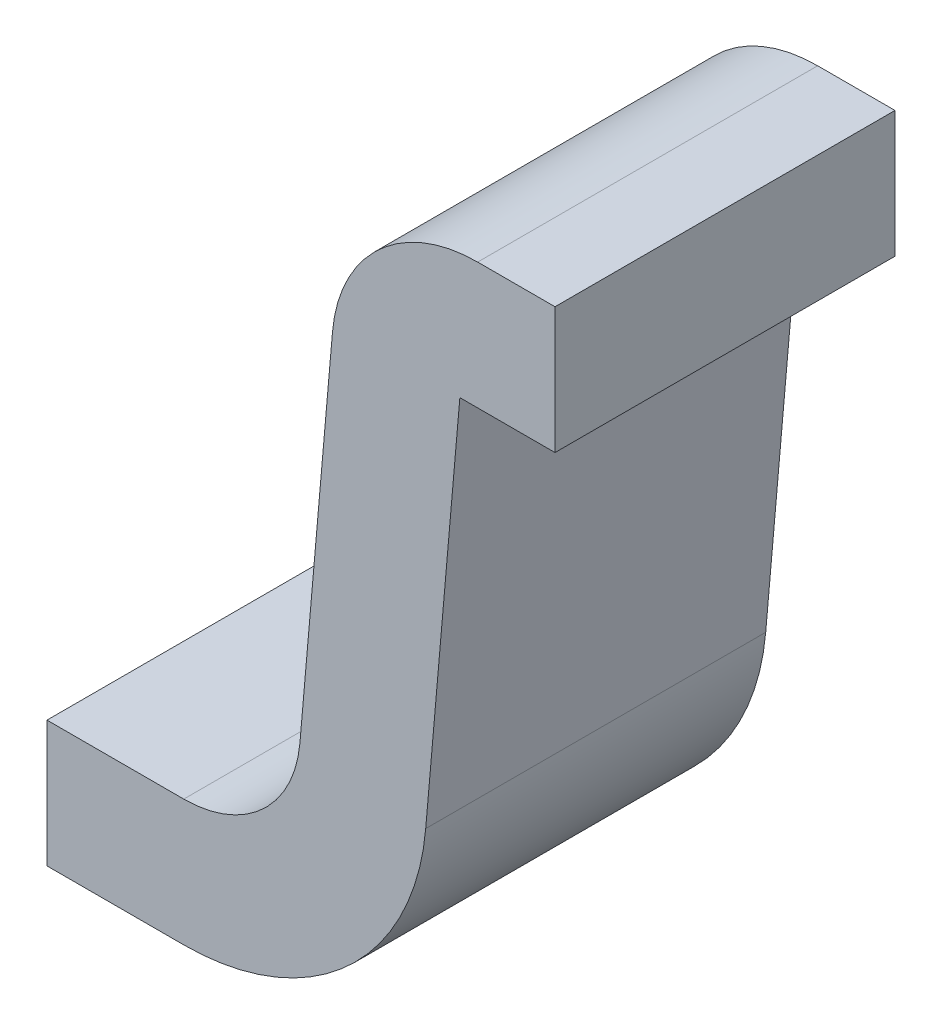
ISO-10303-21;
HEADER;
FILE_DESCRIPTION(('STEP AP214'),'2;1');
FILE_NAME('part.step','',(''),(''),'','','');
FILE_SCHEMA(('AUTOMOTIVE_DESIGN { 1 0 10303 214 1 1 1 1 }'));
ENDSEC;
DATA;
#1=APPLICATION_CONTEXT('core data for automotive mechanical design processes');
#2=APPLICATION_PROTOCOL_DEFINITION('international standard','automotive_design',2000,#1);
#3=PRODUCT_CONTEXT('',#1,'mechanical');
#4=PRODUCT('Part','Part','',(#3));
#5=PRODUCT_RELATED_PRODUCT_CATEGORY('part','',(#4));
#6=PRODUCT_DEFINITION_FORMATION('','',#4);
#7=PRODUCT_DEFINITION_CONTEXT('part definition',#1,'design');
#8=PRODUCT_DEFINITION('design','',#6,#7);
#9=PRODUCT_DEFINITION_SHAPE('','',#8);
#10=(LENGTH_UNIT() NAMED_UNIT(*) SI_UNIT(.MILLI.,.METRE.));
#11=(NAMED_UNIT(*) PLANE_ANGLE_UNIT() SI_UNIT($,.RADIAN.));
#12=(NAMED_UNIT(*) SI_UNIT($,.STERADIAN.) SOLID_ANGLE_UNIT());
#13=UNCERTAINTY_MEASURE_WITH_UNIT(LENGTH_MEASURE(1.E-05),#10,'distance_accuracy_value','');
#14=(GEOMETRIC_REPRESENTATION_CONTEXT(3) GLOBAL_UNCERTAINTY_ASSIGNED_CONTEXT((#13)) GLOBAL_UNIT_ASSIGNED_CONTEXT((#10,
#11,#12)) REPRESENTATION_CONTEXT('',''));
#15=CARTESIAN_POINT('',(0.,0.,0.));
#16=DIRECTION('',(0.,0.,1.));
#17=DIRECTION('',(1.,0.,0.));
#18=AXIS2_PLACEMENT_3D('',#15,#16,#17);
#19=CARTESIAN_POINT('',(-0.284200651525688,-0.38,0.));
#20=DIRECTION('',(0.,0.,-1.));
#21=DIRECTION('',(0.,-1.,0.));
#22=AXIS2_PLACEMENT_3D('',#19,#20,#21);
#23=PLANE('',#22);
#24=DIRECTION('',(0.0871557427476581,0.996194698091746,0.));
#25=VECTOR('',#24,1.);
#26=CARTESIAN_POINT('',(0.,0.,0.));
#27=LINE('',#26,#25);
#28=CARTESIAN_POINT('',(-0.0351519770027516,-0.401788935686914,0.));
#29=VERTEX_POINT('',#28);
#30=CARTESIAN_POINT('',(0.,0.,0.));
#31=VERTEX_POINT('',#30);
#32=EDGE_CURVE('E240',#29,#31,#27,.T.);
#33=ORIENTED_EDGE('',*,*,#32,.F.);
#34=CARTESIAN_POINT('',(-0.284200651525688,-0.38,0.));
#35=DIRECTION('',(0.,0.,1.));
#36=DIRECTION('',(-1.,0.,0.));
#37=AXIS2_PLACEMENT_3D('',#34,#35,#36);
#38=CIRCLE('',#37,0.25);
#39=CARTESIAN_POINT('',(-0.284200651525688,-0.63,0.));
#40=VERTEX_POINT('',#39);
#41=EDGE_CURVE('E25',#40,#29,#38,.T.);
#42=ORIENTED_EDGE('',*,*,#41,.F.);
#43=DIRECTION('',(1.,0.,0.));
#44=VECTOR('',#43,1.);
#45=CARTESIAN_POINT('',(-0.284200651525688,-0.63,0.));
#46=LINE('',#45,#44);
#47=CARTESIAN_POINT('',(-0.425,-0.63,0.));
#48=VERTEX_POINT('',#47);
#49=EDGE_CURVE('E214',#48,#40,#46,.T.);
#50=ORIENTED_EDGE('',*,*,#49,.F.);
#51=DIRECTION('',(0.,-1.,0.));
#52=VECTOR('',#51,1.);
#53=CARTESIAN_POINT('',(-0.425,-0.63,0.));
#54=LINE('',#53,#52);
#55=CARTESIAN_POINT('',(-0.425,-0.5,0.));
#56=VERTEX_POINT('',#55);
#57=EDGE_CURVE('E161',#56,#48,#54,.T.);
#58=ORIENTED_EDGE('',*,*,#57,.F.);
#59=DIRECTION('',(-1.,0.,0.));
#60=VECTOR('',#59,1.);
#61=CARTESIAN_POINT('',(-0.425,-0.5,0.));
#62=LINE('',#61,#60);
#63=CARTESIAN_POINT('',(-0.284200651525688,-0.5,0.));
#64=VERTEX_POINT('',#63);
#65=EDGE_CURVE('E197',#64,#56,#62,.T.);
#66=ORIENTED_EDGE('',*,*,#65,.F.);
#67=CARTESIAN_POINT('',(-0.284200651525688,-0.38,0.));
#68=DIRECTION('',(0.,0.,-1.));
#69=DIRECTION('',(1.,0.,0.));
#70=AXIS2_PLACEMENT_3D('',#67,#68,#69);
#71=CIRCLE('',#70,0.12);
#72=CARTESIAN_POINT('',(-0.164657287754679,-0.390458689129719,0.));
#73=VERTEX_POINT('',#72);
#74=EDGE_CURVE('E187',#73,#64,#71,.T.);
#75=ORIENTED_EDGE('',*,*,#74,.F.);
#76=DIRECTION('',(-0.0871557427476581,-0.996194698091746,0.));
#77=VECTOR('',#76,1.);
#78=CARTESIAN_POINT('',(-0.164657287754679,-0.390458689129719,0.));
#79=LINE('',#78,#77);
#80=CARTESIAN_POINT('',(-0.131102581233413,-0.00692663858785125,0.));
#81=VERTEX_POINT('',#80);
#82=EDGE_CURVE('E176',#81,#73,#79,.T.);
#83=ORIENTED_EDGE('',*,*,#82,.F.);
#84=CARTESIAN_POINT('',(0.0183266234803484,-0.02,0.));
#85=DIRECTION('',(0.,0.,1.));
#86=DIRECTION('',(1.,0.,0.));
#87=AXIS2_PLACEMENT_3D('',#84,#85,#86);
#88=CIRCLE('',#87,0.15);
#89=CARTESIAN_POINT('',(0.0183266234803484,0.13,0.));
#90=VERTEX_POINT('',#89);
#91=EDGE_CURVE('E127',#90,#81,#88,.T.);
#92=ORIENTED_EDGE('',*,*,#91,.F.);
#93=DIRECTION('',(-1.,0.,0.));
#94=VECTOR('',#93,1.);
#95=CARTESIAN_POINT('',(0.0979446320840572,0.13,0.));
#96=LINE('',#95,#94);
#97=CARTESIAN_POINT('',(0.0979446320840572,0.13,0.));
#98=VERTEX_POINT('',#97);
#99=EDGE_CURVE('E123',#98,#90,#96,.T.);
#100=ORIENTED_EDGE('',*,*,#99,.F.);
#101=DIRECTION('',(0.,1.,0.));
#102=VECTOR('',#101,1.);
#103=CARTESIAN_POINT('',(0.0979446320840572,0.,0.));
#104=LINE('',#103,#102);
#105=CARTESIAN_POINT('',(0.0979446320840572,0.,0.));
#106=VERTEX_POINT('',#105);
#107=EDGE_CURVE('E130',#106,#98,#104,.T.);
#108=ORIENTED_EDGE('',*,*,#107,.F.);
#109=DIRECTION('',(1.,0.,0.));
#110=VECTOR('',#109,1.);
#111=CARTESIAN_POINT('',(0.,0.,0.));
#112=LINE('',#111,#110);
#113=EDGE_CURVE('E239',#31,#106,#112,.T.);
#114=ORIENTED_EDGE('',*,*,#113,.F.);
#115=EDGE_LOOP('',(#33,#42,#50,#58,#66,#75,#83,#92,#100,#108,#114));
#116=FACE_BOUND('',#115,.T.);
#117=ADVANCED_FACE('F16',(#116),#23,.T.);
#118=CARTESIAN_POINT('',(-0.284200651525688,-0.38,0.35));
#119=DIRECTION('',(0.,0.,-1.));
#120=DIRECTION('',(0.,-1.,0.));
#121=AXIS2_PLACEMENT_3D('',#118,#119,#120);
#122=PLANE('',#121);
#123=DIRECTION('',(0.0871557427476581,0.996194698091746,0.));
#124=VECTOR('',#123,1.);
#125=CARTESIAN_POINT('',(0.,0.,0.35));
#126=LINE('',#125,#124);
#127=CARTESIAN_POINT('',(-0.0351519770027516,-0.401788935686914,0.35));
#128=VERTEX_POINT('',#127);
#129=CARTESIAN_POINT('',(0.,0.,0.35));
#130=VERTEX_POINT('',#129);
#131=EDGE_CURVE('E238',#128,#130,#126,.T.);
#132=ORIENTED_EDGE('',*,*,#131,.T.);
#133=DIRECTION('',(1.,0.,0.));
#134=VECTOR('',#133,1.);
#135=CARTESIAN_POINT('',(0.,0.,0.35));
#136=LINE('',#135,#134);
#137=CARTESIAN_POINT('',(0.0979446320840572,0.,0.35));
#138=VERTEX_POINT('',#137);
#139=EDGE_CURVE('E151',#130,#138,#136,.T.);
#140=ORIENTED_EDGE('',*,*,#139,.T.);
#141=DIRECTION('',(0.,1.,0.));
#142=VECTOR('',#141,1.);
#143=CARTESIAN_POINT('',(0.0979446320840572,0.,0.35));
#144=LINE('',#143,#142);
#145=CARTESIAN_POINT('',(0.0979446320840572,0.13,0.35));
#146=VERTEX_POINT('',#145);
#147=EDGE_CURVE('E134',#138,#146,#144,.T.);
#148=ORIENTED_EDGE('',*,*,#147,.T.);
#149=DIRECTION('',(-1.,0.,0.));
#150=VECTOR('',#149,1.);
#151=CARTESIAN_POINT('',(0.0979446320840572,0.13,0.35));
#152=LINE('',#151,#150);
#153=CARTESIAN_POINT('',(0.0183266234803484,0.13,0.35));
#154=VERTEX_POINT('',#153);
#155=EDGE_CURVE('E143',#146,#154,#152,.T.);
#156=ORIENTED_EDGE('',*,*,#155,.T.);
#157=CARTESIAN_POINT('',(0.0183266234803484,-0.02,0.35));
#158=DIRECTION('',(0.,0.,1.));
#159=DIRECTION('',(1.,0.,0.));
#160=AXIS2_PLACEMENT_3D('',#157,#158,#159);
#161=CIRCLE('',#160,0.15);
#162=CARTESIAN_POINT('',(-0.131102581233413,-0.00692663858785125,0.35));
#163=VERTEX_POINT('',#162);
#164=EDGE_CURVE('E175',#154,#163,#161,.T.);
#165=ORIENTED_EDGE('',*,*,#164,.T.);
#166=DIRECTION('',(-0.0871557427476581,-0.996194698091746,0.));
#167=VECTOR('',#166,1.);
#168=CARTESIAN_POINT('',(-0.164657287754679,-0.390458689129719,0.35));
#169=LINE('',#168,#167);
#170=CARTESIAN_POINT('',(-0.164657287754679,-0.390458689129719,0.35));
#171=VERTEX_POINT('',#170);
#172=EDGE_CURVE('E182',#163,#171,#169,.T.);
#173=ORIENTED_EDGE('',*,*,#172,.T.);
#174=CARTESIAN_POINT('',(-0.284200651525688,-0.38,0.35));
#175=DIRECTION('',(0.,0.,-1.));
#176=DIRECTION('',(1.,0.,0.));
#177=AXIS2_PLACEMENT_3D('',#174,#175,#176);
#178=CIRCLE('',#177,0.12);
#179=CARTESIAN_POINT('',(-0.284200651525688,-0.5,0.35));
#180=VERTEX_POINT('',#179);
#181=EDGE_CURVE('E198',#171,#180,#178,.T.);
#182=ORIENTED_EDGE('',*,*,#181,.T.);
#183=DIRECTION('',(-1.,0.,0.));
#184=VECTOR('',#183,1.);
#185=CARTESIAN_POINT('',(-0.425,-0.5,0.35));
#186=LINE('',#185,#184);
#187=CARTESIAN_POINT('',(-0.425,-0.5,0.35));
#188=VERTEX_POINT('',#187);
#189=EDGE_CURVE('E164',#180,#188,#186,.T.);
#190=ORIENTED_EDGE('',*,*,#189,.T.);
#191=DIRECTION('',(0.,-1.,0.));
#192=VECTOR('',#191,1.);
#193=CARTESIAN_POINT('',(-0.425,-0.63,0.35));
#194=LINE('',#193,#192);
#195=CARTESIAN_POINT('',(-0.425,-0.63,0.35));
#196=VERTEX_POINT('',#195);
#197=EDGE_CURVE('E211',#188,#196,#194,.T.);
#198=ORIENTED_EDGE('',*,*,#197,.T.);
#199=DIRECTION('',(1.,0.,0.));
#200=VECTOR('',#199,1.);
#201=CARTESIAN_POINT('',(-0.284200651525688,-0.63,0.35));
#202=LINE('',#201,#200);
#203=CARTESIAN_POINT('',(-0.284200651525688,-0.63,0.35));
#204=VERTEX_POINT('',#203);
#205=EDGE_CURVE('E225',#196,#204,#202,.T.);
#206=ORIENTED_EDGE('',*,*,#205,.T.);
#207=CARTESIAN_POINT('',(-0.284200651525688,-0.38,0.35));
#208=DIRECTION('',(0.,0.,1.));
#209=DIRECTION('',(-1.,0.,0.));
#210=AXIS2_PLACEMENT_3D('',#207,#208,#209);
#211=CIRCLE('',#210,0.25);
#212=EDGE_CURVE('E11',#204,#128,#211,.T.);
#213=ORIENTED_EDGE('',*,*,#212,.T.);
#214=EDGE_LOOP('',(#132,#140,#148,#156,#165,#173,#182,#190,#198,#206,#213));
#215=FACE_BOUND('',#214,.T.);
#216=ADVANCED_FACE('F18',(#215),#122,.F.);
#217=CARTESIAN_POINT('',(-0.284200651525688,-0.38,0.35));
#218=DIRECTION('',(0.,0.,-1.));
#219=DIRECTION('',(-1.,0.,0.));
#220=AXIS2_PLACEMENT_3D('',#217,#218,#219);
#221=CYLINDRICAL_SURFACE('',#220,0.25);
#222=ORIENTED_EDGE('',*,*,#41,.T.);
#223=DIRECTION('',(0.,0.,-1.));
#224=VECTOR('',#223,1.);
#225=CARTESIAN_POINT('',(-0.0351519770027516,-0.401788935686914,0.35));
#226=LINE('',#225,#224);
#227=EDGE_CURVE('E228',#128,#29,#226,.T.);
#228=ORIENTED_EDGE('',*,*,#227,.F.);
#229=ORIENTED_EDGE('',*,*,#212,.F.);
#230=DIRECTION('',(0.,0.,-1.));
#231=VECTOR('',#230,1.);
#232=CARTESIAN_POINT('',(-0.284200651525688,-0.63,0.35));
#233=LINE('',#232,#231);
#234=EDGE_CURVE('E218',#204,#40,#233,.T.);
#235=ORIENTED_EDGE('',*,*,#234,.T.);
#236=EDGE_LOOP('',(#222,#228,#229,#235));
#237=FACE_BOUND('',#236,.T.);
#238=ADVANCED_FACE('F229',(#237),#221,.T.);
#239=CARTESIAN_POINT('',(-0.284200651525688,-0.63,0.35));
#240=DIRECTION('',(0.,1.,0.));
#241=DIRECTION('',(1.,0.,0.));
#242=AXIS2_PLACEMENT_3D('',#239,#240,#241);
#243=PLANE('',#242);
#244=ORIENTED_EDGE('',*,*,#49,.T.);
#245=ORIENTED_EDGE('',*,*,#234,.F.);
#246=ORIENTED_EDGE('',*,*,#205,.F.);
#247=DIRECTION('',(0.,0.,-1.));
#248=VECTOR('',#247,1.);
#249=CARTESIAN_POINT('',(-0.425,-0.63,0.35));
#250=LINE('',#249,#248);
#251=EDGE_CURVE('E163',#196,#48,#250,.T.);
#252=ORIENTED_EDGE('',*,*,#251,.T.);
#253=EDGE_LOOP('',(#244,#245,#246,#252));
#254=FACE_BOUND('',#253,.T.);
#255=ADVANCED_FACE('F427',(#254),#243,.F.);
#256=CARTESIAN_POINT('',(-0.425,-0.63,0.35));
#257=DIRECTION('',(1.,0.,0.));
#258=DIRECTION('',(0.,-1.,0.));
#259=AXIS2_PLACEMENT_3D('',#256,#257,#258);
#260=PLANE('',#259);
#261=ORIENTED_EDGE('',*,*,#57,.T.);
#262=ORIENTED_EDGE('',*,*,#251,.F.);
#263=ORIENTED_EDGE('',*,*,#197,.F.);
#264=DIRECTION('',(0.,0.,-1.));
#265=VECTOR('',#264,1.);
#266=CARTESIAN_POINT('',(-0.425,-0.5,0.35));
#267=LINE('',#266,#265);
#268=EDGE_CURVE('E203',#188,#56,#267,.T.);
#269=ORIENTED_EDGE('',*,*,#268,.T.);
#270=EDGE_LOOP('',(#261,#262,#263,#269));
#271=FACE_BOUND('',#270,.T.);
#272=ADVANCED_FACE('F414',(#271),#260,.F.);
#273=CARTESIAN_POINT('',(-0.425,-0.5,0.35));
#274=DIRECTION('',(0.,-1.,0.));
#275=DIRECTION('',(0.,0.,-1.));
#276=AXIS2_PLACEMENT_3D('',#273,#274,#275);
#277=PLANE('',#276);
#278=ORIENTED_EDGE('',*,*,#65,.T.);
#279=ORIENTED_EDGE('',*,*,#268,.F.);
#280=ORIENTED_EDGE('',*,*,#189,.F.);
#281=DIRECTION('',(0.,0.,-1.));
#282=VECTOR('',#281,1.);
#283=CARTESIAN_POINT('',(-0.284200651525688,-0.5,0.35));
#284=LINE('',#283,#282);
#285=EDGE_CURVE('E195',#180,#64,#284,.T.);
#286=ORIENTED_EDGE('',*,*,#285,.T.);
#287=EDGE_LOOP('',(#278,#279,#280,#286));
#288=FACE_BOUND('',#287,.T.);
#289=ADVANCED_FACE('F407',(#288),#277,.F.);
#290=CARTESIAN_POINT('',(-0.284200651525688,-0.38,0.35));
#291=DIRECTION('',(0.,0.,-1.));
#292=DIRECTION('',(-1.,0.,0.));
#293=AXIS2_PLACEMENT_3D('',#290,#291,#292);
#294=CYLINDRICAL_SURFACE('',#293,0.12);
#295=ORIENTED_EDGE('',*,*,#74,.T.);
#296=ORIENTED_EDGE('',*,*,#285,.F.);
#297=ORIENTED_EDGE('',*,*,#181,.F.);
#298=DIRECTION('',(0.,0.,-1.));
#299=VECTOR('',#298,1.);
#300=CARTESIAN_POINT('',(-0.164657287754679,-0.390458689129719,0.35));
#301=LINE('',#300,#299);
#302=EDGE_CURVE('E179',#171,#73,#301,.T.);
#303=ORIENTED_EDGE('',*,*,#302,.T.);
#304=EDGE_LOOP('',(#295,#296,#297,#303));
#305=FACE_BOUND('',#304,.T.);
#306=ADVANCED_FACE('F380',(#305),#294,.F.);
#307=CARTESIAN_POINT('',(-0.164657287754679,-0.390458689129719,0.35));
#308=DIRECTION('',(0.996194698091746,-0.0871557427476581,0.));
#309=DIRECTION('',(0.,0.,-1.));
#310=AXIS2_PLACEMENT_3D('',#307,#308,#309);
#311=PLANE('',#310);
#312=ORIENTED_EDGE('',*,*,#82,.T.);
#313=ORIENTED_EDGE('',*,*,#302,.F.);
#314=ORIENTED_EDGE('',*,*,#172,.F.);
#315=DIRECTION('',(0.,0.,-1.));
#316=VECTOR('',#315,1.);
#317=CARTESIAN_POINT('',(-0.131102581233413,-0.00692663858785125,0.35));
#318=LINE('',#317,#316);
#319=EDGE_CURVE('E171',#163,#81,#318,.T.);
#320=ORIENTED_EDGE('',*,*,#319,.T.);
#321=EDGE_LOOP('',(#312,#313,#314,#320));
#322=FACE_BOUND('',#321,.T.);
#323=ADVANCED_FACE('F371',(#322),#311,.F.);
#324=CARTESIAN_POINT('',(0.0183266234803484,-0.02,0.35));
#325=DIRECTION('',(0.,0.,-1.));
#326=DIRECTION('',(-1.,0.,0.));
#327=AXIS2_PLACEMENT_3D('',#324,#325,#326);
#328=CYLINDRICAL_SURFACE('',#327,0.15);
#329=ORIENTED_EDGE('',*,*,#91,.T.);
#330=ORIENTED_EDGE('',*,*,#319,.F.);
#331=ORIENTED_EDGE('',*,*,#164,.F.);
#332=DIRECTION('',(0.,0.,-1.));
#333=VECTOR('',#332,1.);
#334=CARTESIAN_POINT('',(0.0183266234803484,0.13,0.35));
#335=LINE('',#334,#333);
#336=EDGE_CURVE('E133',#154,#90,#335,.T.);
#337=ORIENTED_EDGE('',*,*,#336,.T.);
#338=EDGE_LOOP('',(#329,#330,#331,#337));
#339=FACE_BOUND('',#338,.T.);
#340=ADVANCED_FACE('F376',(#339),#328,.T.);
#341=CARTESIAN_POINT('',(0.0979446320840572,0.13,0.35));
#342=DIRECTION('',(0.,-1.,0.));
#343=DIRECTION('',(0.,0.,-1.));
#344=AXIS2_PLACEMENT_3D('',#341,#342,#343);
#345=PLANE('',#344);
#346=ORIENTED_EDGE('',*,*,#99,.T.);
#347=ORIENTED_EDGE('',*,*,#336,.F.);
#348=ORIENTED_EDGE('',*,*,#155,.F.);
#349=DIRECTION('',(0.,0.,-1.));
#350=VECTOR('',#349,1.);
#351=CARTESIAN_POINT('',(0.0979446320840572,0.13,0.35));
#352=LINE('',#351,#350);
#353=EDGE_CURVE('E139',#146,#98,#352,.T.);
#354=ORIENTED_EDGE('',*,*,#353,.T.);
#355=EDGE_LOOP('',(#346,#347,#348,#354));
#356=FACE_BOUND('',#355,.T.);
#357=ADVANCED_FACE('F136',(#356),#345,.F.);
#358=CARTESIAN_POINT('',(0.0979446320840572,0.,0.35));
#359=DIRECTION('',(-1.,0.,0.));
#360=DIRECTION('',(0.,0.,1.));
#361=AXIS2_PLACEMENT_3D('',#358,#359,#360);
#362=PLANE('',#361);
#363=ORIENTED_EDGE('',*,*,#107,.T.);
#364=ORIENTED_EDGE('',*,*,#353,.F.);
#365=ORIENTED_EDGE('',*,*,#147,.F.);
#366=DIRECTION('',(0.,0.,-1.));
#367=VECTOR('',#366,1.);
#368=CARTESIAN_POINT('',(0.0979446320840572,0.,0.35));
#369=LINE('',#368,#367);
#370=EDGE_CURVE('E146',#138,#106,#369,.T.);
#371=ORIENTED_EDGE('',*,*,#370,.T.);
#372=EDGE_LOOP('',(#363,#364,#365,#371));
#373=FACE_BOUND('',#372,.T.);
#374=ADVANCED_FACE('F148',(#373),#362,.F.);
#375=CARTESIAN_POINT('',(0.,0.,0.35));
#376=DIRECTION('',(0.,1.,0.));
#377=DIRECTION('',(1.,0.,0.));
#378=AXIS2_PLACEMENT_3D('',#375,#376,#377);
#379=PLANE('',#378);
#380=ORIENTED_EDGE('',*,*,#113,.T.);
#381=ORIENTED_EDGE('',*,*,#370,.F.);
#382=ORIENTED_EDGE('',*,*,#139,.F.);
#383=DIRECTION('',(0.,0.,-1.));
#384=VECTOR('',#383,1.);
#385=CARTESIAN_POINT('',(0.,0.,0.35));
#386=LINE('',#385,#384);
#387=EDGE_CURVE('E243',#130,#31,#386,.T.);
#388=ORIENTED_EDGE('',*,*,#387,.T.);
#389=EDGE_LOOP('',(#380,#381,#382,#388));
#390=FACE_BOUND('',#389,.T.);
#391=ADVANCED_FACE('F368',(#390),#379,.F.);
#392=CARTESIAN_POINT('',(0.,0.,0.35));
#393=DIRECTION('',(-0.996194698091746,0.0871557427476581,0.));
#394=DIRECTION('',(0.,0.,1.));
#395=AXIS2_PLACEMENT_3D('',#392,#393,#394);
#396=PLANE('',#395);
#397=ORIENTED_EDGE('',*,*,#32,.T.);
#398=ORIENTED_EDGE('',*,*,#387,.F.);
#399=ORIENTED_EDGE('',*,*,#131,.F.);
#400=ORIENTED_EDGE('',*,*,#227,.T.);
#401=EDGE_LOOP('',(#397,#398,#399,#400));
#402=FACE_BOUND('',#401,.T.);
#403=ADVANCED_FACE('F232',(#402),#396,.F.);
#404=CLOSED_SHELL('',(#117,#216,#238,#255,#272,#289,#306,#323,#340,#357,#374,#391,#403));
#405=MANIFOLD_SOLID_BREP('B1',#404);
#406=ADVANCED_BREP_SHAPE_REPRESENTATION('',(#18,#405),#14);
#407=SHAPE_DEFINITION_REPRESENTATION(#9,#406);
ENDSEC;
END-ISO-10303-21;
